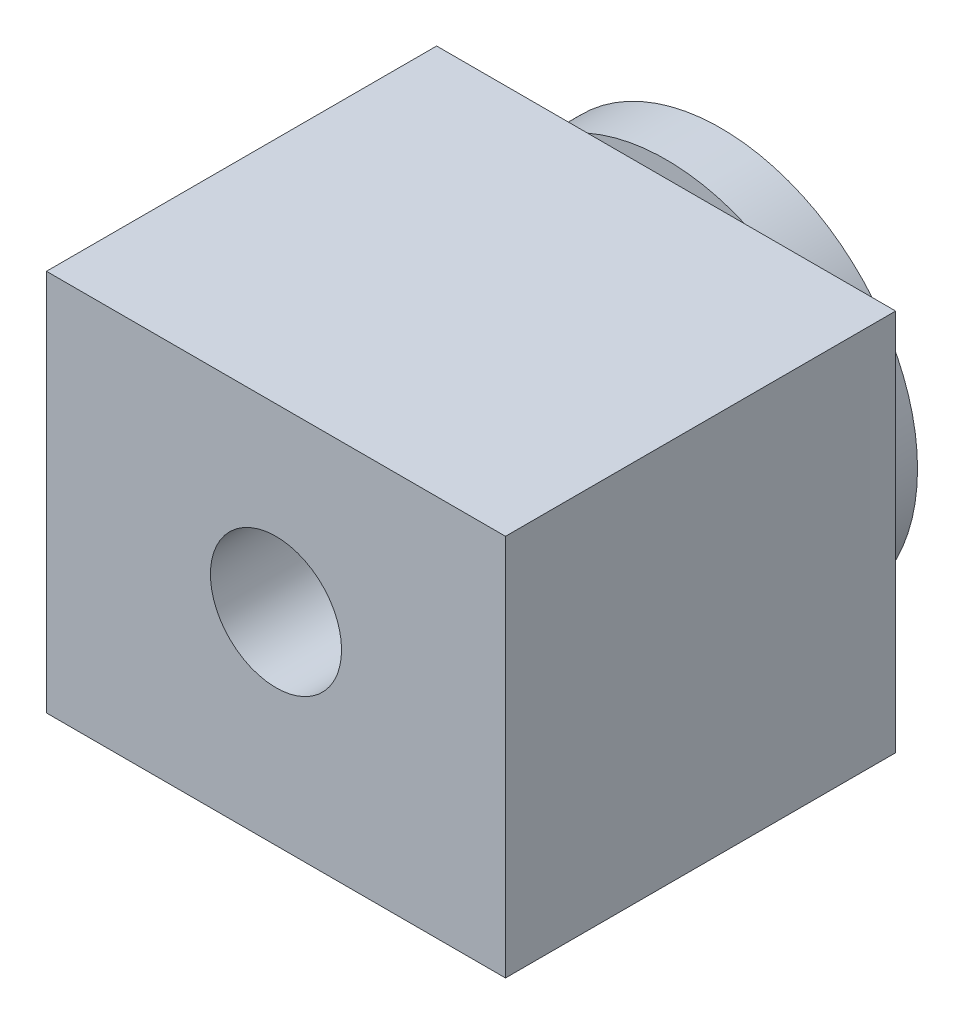
ISO-10303-21;
HEADER;
FILE_DESCRIPTION(('STEP AP214'),'2;1');
FILE_NAME('part.step','',(''),(''),'','','');
FILE_SCHEMA(('AUTOMOTIVE_DESIGN { 1 0 10303 214 1 1 1 1 }'));
ENDSEC;
DATA;
#1=APPLICATION_CONTEXT('core data for automotive mechanical design processes');
#2=APPLICATION_PROTOCOL_DEFINITION('international standard','automotive_design',2000,#1);
#3=PRODUCT_CONTEXT('',#1,'mechanical');
#4=PRODUCT('Part','Part','',(#3));
#5=PRODUCT_RELATED_PRODUCT_CATEGORY('part','',(#4));
#6=PRODUCT_DEFINITION_FORMATION('','',#4);
#7=PRODUCT_DEFINITION_CONTEXT('part definition',#1,'design');
#8=PRODUCT_DEFINITION('design','',#6,#7);
#9=PRODUCT_DEFINITION_SHAPE('','',#8);
#10=(LENGTH_UNIT() NAMED_UNIT(*) SI_UNIT(.MILLI.,.METRE.));
#11=(NAMED_UNIT(*) PLANE_ANGLE_UNIT() SI_UNIT($,.RADIAN.));
#12=(NAMED_UNIT(*) SI_UNIT($,.STERADIAN.) SOLID_ANGLE_UNIT());
#13=UNCERTAINTY_MEASURE_WITH_UNIT(LENGTH_MEASURE(1.E-05),#10,'distance_accuracy_value','');
#14=(GEOMETRIC_REPRESENTATION_CONTEXT(3) GLOBAL_UNCERTAINTY_ASSIGNED_CONTEXT((#13)) GLOBAL_UNIT_ASSIGNED_CONTEXT((#10,
#11,#12)) REPRESENTATION_CONTEXT('',''));
#15=CARTESIAN_POINT('',(0.,0.,0.));
#16=DIRECTION('',(0.,0.,1.));
#17=DIRECTION('',(1.,0.,0.));
#18=AXIS2_PLACEMENT_3D('',#15,#16,#17);
#19=CARTESIAN_POINT('',(0.,0.,5.));
#20=DIRECTION('',(0.,0.,1.));
#21=DIRECTION('',(1.,0.,0.));
#22=AXIS2_PLACEMENT_3D('',#19,#20,#21);
#23=PLANE('',#22);
#24=DIRECTION('',(-1.,0.,0.));
#25=VECTOR('',#24,1.);
#26=CARTESIAN_POINT('',(21.,16.5,5.));
#27=LINE('',#26,#25);
#28=CARTESIAN_POINT('',(7.19374728496909,16.5,5.));
#29=VERTEX_POINT('',#28);
#30=CARTESIAN_POINT('',(-7.19374728496908,16.5,5.));
#31=VERTEX_POINT('',#30);
#32=EDGE_CURVE('E11',#29,#31,#27,.T.);
#33=ORIENTED_EDGE('',*,*,#32,.F.);
#34=CARTESIAN_POINT('',(0.,0.,5.));
#35=DIRECTION('',(0.,0.,1.));
#36=DIRECTION('',(1.,0.,0.));
#37=AXIS2_PLACEMENT_3D('',#34,#35,#36);
#38=CIRCLE('',#37,18.);
#39=EDGE_CURVE('E49',#29,#31,#38,.T.);
#40=ORIENTED_EDGE('',*,*,#39,.T.);
#41=EDGE_LOOP('',(#33,#40));
#42=FACE_BOUND('',#41,.T.);
#43=ADVANCED_FACE('F39',(#42),#23,.T.);
#44=CARTESIAN_POINT('',(0.,0.,0.));
#45=DIRECTION('',(0.,0.,1.));
#46=DIRECTION('',(1.,0.,0.));
#47=AXIS2_PLACEMENT_3D('',#44,#45,#46);
#48=PLANE('',#47);
#49=CARTESIAN_POINT('',(0.,0.,0.));
#50=DIRECTION('',(0.,0.,1.));
#51=DIRECTION('',(1.,0.,0.));
#52=AXIS2_PLACEMENT_3D('',#49,#50,#51);
#53=CIRCLE('',#52,18.);
#54=CARTESIAN_POINT('',(18.,0.,0.));
#55=VERTEX_POINT('',#54);
#56=EDGE_CURVE('E43',#55,#55,#53,.T.);
#57=ORIENTED_EDGE('',*,*,#56,.F.);
#58=EDGE_LOOP('',(#57));
#59=FACE_BOUND('',#58,.T.);
#60=CARTESIAN_POINT('',(0.,0.,0.));
#61=DIRECTION('',(0.,0.,1.));
#62=DIRECTION('',(1.,0.,0.));
#63=AXIS2_PLACEMENT_3D('',#60,#61,#62);
#64=CIRCLE('',#63,6.);
#65=CARTESIAN_POINT('',(6.,0.,0.));
#66=VERTEX_POINT('',#65);
#67=EDGE_CURVE('E114',#66,#66,#64,.T.);
#68=ORIENTED_EDGE('',*,*,#67,.T.);
#69=EDGE_LOOP('',(#68));
#70=FACE_BOUND('',#69,.T.);
#71=ADVANCED_FACE('F136',(#59,#70),#48,.F.);
#72=CARTESIAN_POINT('',(0.,0.,5.));
#73=DIRECTION('',(0.,0.,-1.));
#74=DIRECTION('',(-1.,0.,0.));
#75=AXIS2_PLACEMENT_3D('',#72,#73,#74);
#76=CYLINDRICAL_SURFACE('',#75,18.);
#77=ORIENTED_EDGE('',*,*,#39,.F.);
#78=EDGE_CURVE('E124',#31,#29,#38,.T.);
#79=ORIENTED_EDGE('',*,*,#78,.F.);
#80=EDGE_LOOP('',(#77,#79));
#81=FACE_BOUND('',#80,.T.);
#82=ORIENTED_EDGE('',*,*,#56,.T.);
#83=EDGE_LOOP('',(#82));
#84=FACE_BOUND('',#83,.T.);
#85=ADVANCED_FACE('F41',(#81,#84),#76,.T.);
#86=CARTESIAN_POINT('',(0.,0.,5.));
#87=DIRECTION('',(0.,0.,-1.));
#88=DIRECTION('',(-1.,0.,0.));
#89=AXIS2_PLACEMENT_3D('',#86,#87,#88);
#90=CYLINDRICAL_SURFACE('',#89,6.);
#91=ORIENTED_EDGE('',*,*,#67,.F.);
#92=EDGE_LOOP('',(#91));
#93=FACE_BOUND('',#92,.T.);
#94=CARTESIAN_POINT('',(0.,0.,40.7));
#95=DIRECTION('',(0.,0.,1.));
#96=DIRECTION('',(1.,0.,0.));
#97=AXIS2_PLACEMENT_3D('',#94,#95,#96);
#98=CIRCLE('',#97,6.);
#99=CARTESIAN_POINT('',(6.,0.,40.7));
#100=VERTEX_POINT('',#99);
#101=EDGE_CURVE('E148',#100,#100,#98,.T.);
#102=ORIENTED_EDGE('',*,*,#101,.T.);
#103=EDGE_LOOP('',(#102));
#104=FACE_BOUND('',#103,.T.);
#105=ADVANCED_FACE('F141',(#93,#104),#90,.F.);
#106=CARTESIAN_POINT('',(0.,0.,5.));
#107=DIRECTION('',(0.,0.,1.));
#108=DIRECTION('',(1.,0.,0.));
#109=AXIS2_PLACEMENT_3D('',#106,#107,#108);
#110=PLANE('',#109);
#111=CARTESIAN_POINT('',(-21.,16.5,5.));
#112=VERTEX_POINT('',#111);
#113=EDGE_CURVE('E52',#31,#112,#27,.T.);
#114=ORIENTED_EDGE('',*,*,#113,.F.);
#115=ORIENTED_EDGE('',*,*,#78,.T.);
#116=CARTESIAN_POINT('',(21.,16.5,5.));
#117=VERTEX_POINT('',#116);
#118=EDGE_CURVE('E51',#117,#29,#27,.T.);
#119=ORIENTED_EDGE('',*,*,#118,.F.);
#120=DIRECTION('',(0.,1.,0.));
#121=VECTOR('',#120,1.);
#122=CARTESIAN_POINT('',(21.,-18.5,5.));
#123=LINE('',#122,#121);
#124=CARTESIAN_POINT('',(21.,-18.5,5.));
#125=VERTEX_POINT('',#124);
#126=EDGE_CURVE('E162',#125,#117,#123,.T.);
#127=ORIENTED_EDGE('',*,*,#126,.F.);
#128=DIRECTION('',(1.,0.,0.));
#129=VECTOR('',#128,1.);
#130=CARTESIAN_POINT('',(21.,-18.5,5.));
#131=LINE('',#130,#129);
#132=CARTESIAN_POINT('',(-21.,-18.5,5.));
#133=VERTEX_POINT('',#132);
#134=EDGE_CURVE('E152',#133,#125,#131,.T.);
#135=ORIENTED_EDGE('',*,*,#134,.F.);
#136=DIRECTION('',(0.,-1.,0.));
#137=VECTOR('',#136,1.);
#138=CARTESIAN_POINT('',(-21.,-18.5,5.));
#139=LINE('',#138,#137);
#140=EDGE_CURVE('E112',#112,#133,#139,.T.);
#141=ORIENTED_EDGE('',*,*,#140,.F.);
#142=EDGE_LOOP('',(#114,#115,#119,#127,#135,#141));
#143=FACE_BOUND('',#142,.T.);
#144=ADVANCED_FACE('F144',(#143),#110,.F.);
#145=CARTESIAN_POINT('',(0.,0.,40.7));
#146=DIRECTION('',(0.,0.,1.));
#147=DIRECTION('',(1.,0.,0.));
#148=AXIS2_PLACEMENT_3D('',#145,#146,#147);
#149=PLANE('',#148);
#150=DIRECTION('',(0.,-1.,0.));
#151=VECTOR('',#150,1.);
#152=CARTESIAN_POINT('',(-21.,-18.5,40.7));
#153=LINE('',#152,#151);
#154=CARTESIAN_POINT('',(-21.,16.5,40.7));
#155=VERTEX_POINT('',#154);
#156=CARTESIAN_POINT('',(-21.,-18.5,40.7));
#157=VERTEX_POINT('',#156);
#158=EDGE_CURVE('E98',#155,#157,#153,.T.);
#159=ORIENTED_EDGE('',*,*,#158,.T.);
#160=DIRECTION('',(1.,0.,0.));
#161=VECTOR('',#160,1.);
#162=CARTESIAN_POINT('',(21.,-18.5,40.7));
#163=LINE('',#162,#161);
#164=CARTESIAN_POINT('',(21.,-18.5,40.7));
#165=VERTEX_POINT('',#164);
#166=EDGE_CURVE('E86',#157,#165,#163,.T.);
#167=ORIENTED_EDGE('',*,*,#166,.T.);
#168=DIRECTION('',(0.,1.,0.));
#169=VECTOR('',#168,1.);
#170=CARTESIAN_POINT('',(21.,-18.5,40.7));
#171=LINE('',#170,#169);
#172=CARTESIAN_POINT('',(21.,16.5,40.7));
#173=VERTEX_POINT('',#172);
#174=EDGE_CURVE('E97',#165,#173,#171,.T.);
#175=ORIENTED_EDGE('',*,*,#174,.T.);
#176=DIRECTION('',(-1.,0.,0.));
#177=VECTOR('',#176,1.);
#178=CARTESIAN_POINT('',(21.,16.5,40.7));
#179=LINE('',#178,#177);
#180=EDGE_CURVE('E104',#173,#155,#179,.T.);
#181=ORIENTED_EDGE('',*,*,#180,.T.);
#182=EDGE_LOOP('',(#159,#167,#175,#181));
#183=FACE_BOUND('',#182,.T.);
#184=ORIENTED_EDGE('',*,*,#101,.F.);
#185=EDGE_LOOP('',(#184));
#186=FACE_BOUND('',#185,.T.);
#187=ADVANCED_FACE('F101',(#183,#186),#149,.T.);
#188=CARTESIAN_POINT('',(-21.,-18.5,40.7));
#189=DIRECTION('',(1.,0.,0.));
#190=DIRECTION('',(0.,0.,-1.));
#191=AXIS2_PLACEMENT_3D('',#188,#189,#190);
#192=PLANE('',#191);
#193=ORIENTED_EDGE('',*,*,#140,.T.);
#194=DIRECTION('',(0.,0.,-1.));
#195=VECTOR('',#194,1.);
#196=CARTESIAN_POINT('',(-21.,-18.5,40.7));
#197=LINE('',#196,#195);
#198=EDGE_CURVE('E90',#157,#133,#197,.T.);
#199=ORIENTED_EDGE('',*,*,#198,.F.);
#200=ORIENTED_EDGE('',*,*,#158,.F.);
#201=DIRECTION('',(0.,0.,-1.));
#202=VECTOR('',#201,1.);
#203=CARTESIAN_POINT('',(-21.,16.5,40.7));
#204=LINE('',#203,#202);
#205=EDGE_CURVE('E158',#155,#112,#204,.T.);
#206=ORIENTED_EDGE('',*,*,#205,.T.);
#207=EDGE_LOOP('',(#193,#199,#200,#206));
#208=FACE_BOUND('',#207,.T.);
#209=ADVANCED_FACE('F110',(#208),#192,.F.);
#210=CARTESIAN_POINT('',(21.,-18.5,40.7));
#211=DIRECTION('',(0.,1.,0.));
#212=DIRECTION('',(-1.,0.,0.));
#213=AXIS2_PLACEMENT_3D('',#210,#211,#212);
#214=PLANE('',#213);
#215=ORIENTED_EDGE('',*,*,#134,.T.);
#216=DIRECTION('',(0.,0.,-1.));
#217=VECTOR('',#216,1.);
#218=CARTESIAN_POINT('',(21.,-18.5,40.7));
#219=LINE('',#218,#217);
#220=EDGE_CURVE('E93',#165,#125,#219,.T.);
#221=ORIENTED_EDGE('',*,*,#220,.F.);
#222=ORIENTED_EDGE('',*,*,#166,.F.);
#223=ORIENTED_EDGE('',*,*,#198,.T.);
#224=EDGE_LOOP('',(#215,#221,#222,#223));
#225=FACE_BOUND('',#224,.T.);
#226=ADVANCED_FACE('F88',(#225),#214,.F.);
#227=CARTESIAN_POINT('',(21.,-18.5,40.7));
#228=DIRECTION('',(-1.,0.,0.));
#229=DIRECTION('',(0.,0.,1.));
#230=AXIS2_PLACEMENT_3D('',#227,#228,#229);
#231=PLANE('',#230);
#232=ORIENTED_EDGE('',*,*,#126,.T.);
#233=DIRECTION('',(0.,0.,-1.));
#234=VECTOR('',#233,1.);
#235=CARTESIAN_POINT('',(21.,16.5,40.7));
#236=LINE('',#235,#234);
#237=EDGE_CURVE('E120',#173,#117,#236,.T.);
#238=ORIENTED_EDGE('',*,*,#237,.F.);
#239=ORIENTED_EDGE('',*,*,#174,.F.);
#240=ORIENTED_EDGE('',*,*,#220,.T.);
#241=EDGE_LOOP('',(#232,#238,#239,#240));
#242=FACE_BOUND('',#241,.T.);
#243=ADVANCED_FACE('F174',(#242),#231,.F.);
#244=CARTESIAN_POINT('',(21.,16.5,40.7));
#245=DIRECTION('',(0.,-1.,0.));
#246=DIRECTION('',(1.,0.,0.));
#247=AXIS2_PLACEMENT_3D('',#244,#245,#246);
#248=PLANE('',#247);
#249=ORIENTED_EDGE('',*,*,#118,.T.);
#250=ORIENTED_EDGE('',*,*,#32,.T.);
#251=ORIENTED_EDGE('',*,*,#113,.T.);
#252=ORIENTED_EDGE('',*,*,#205,.F.);
#253=ORIENTED_EDGE('',*,*,#180,.F.);
#254=ORIENTED_EDGE('',*,*,#237,.T.);
#255=EDGE_LOOP('',(#249,#250,#251,#252,#253,#254));
#256=FACE_BOUND('',#255,.T.);
#257=ADVANCED_FACE('F171',(#256),#248,.F.);
#258=CLOSED_SHELL('',(#43,#71,#85,#105,#144,#187,#209,#226,#243,#257));
#259=MANIFOLD_SOLID_BREP('B2',#258);
#260=ADVANCED_BREP_SHAPE_REPRESENTATION('',(#18,#259),#14);
#261=SHAPE_DEFINITION_REPRESENTATION(#9,#260);
ENDSEC;
END-ISO-10303-21;
